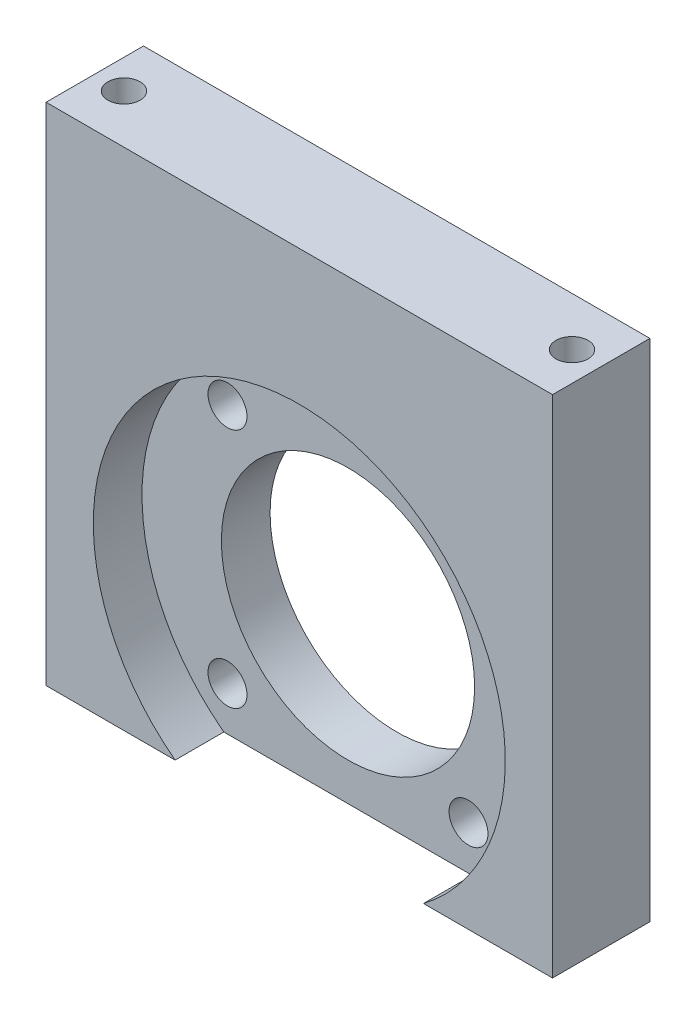
ISO-10303-21;
HEADER;
FILE_DESCRIPTION(('STEP AP214'),'2;1');
FILE_NAME('part.step','',(''),(''),'','','');
FILE_SCHEMA(('AUTOMOTIVE_DESIGN { 1 0 10303 214 1 1 1 1 }'));
ENDSEC;
DATA;
#1=APPLICATION_CONTEXT('core data for automotive mechanical design processes');
#2=APPLICATION_PROTOCOL_DEFINITION('international standard','automotive_design',2000,#1);
#3=PRODUCT_CONTEXT('',#1,'mechanical');
#4=PRODUCT('Part','Part','',(#3));
#5=PRODUCT_RELATED_PRODUCT_CATEGORY('part','',(#4));
#6=PRODUCT_DEFINITION_FORMATION('','',#4);
#7=PRODUCT_DEFINITION_CONTEXT('part definition',#1,'design');
#8=PRODUCT_DEFINITION('design','',#6,#7);
#9=PRODUCT_DEFINITION_SHAPE('','',#8);
#10=(LENGTH_UNIT() NAMED_UNIT(*) SI_UNIT(.MILLI.,.METRE.));
#11=(NAMED_UNIT(*) PLANE_ANGLE_UNIT() SI_UNIT($,.RADIAN.));
#12=(NAMED_UNIT(*) SI_UNIT($,.STERADIAN.) SOLID_ANGLE_UNIT());
#13=UNCERTAINTY_MEASURE_WITH_UNIT(LENGTH_MEASURE(1.E-05),#10,'distance_accuracy_value','');
#14=(GEOMETRIC_REPRESENTATION_CONTEXT(3) GLOBAL_UNCERTAINTY_ASSIGNED_CONTEXT((#13)) GLOBAL_UNIT_ASSIGNED_CONTEXT((#10,
#11,#12)) REPRESENTATION_CONTEXT('',''));
#15=CARTESIAN_POINT('',(0.,0.,0.));
#16=DIRECTION('',(0.,0.,1.));
#17=DIRECTION('',(1.,0.,0.));
#18=AXIS2_PLACEMENT_3D('',#15,#16,#17);
#19=CARTESIAN_POINT('',(26.,25.,-28.));
#20=DIRECTION('',(0.,0.,1.));
#21=DIRECTION('',(1.,0.,0.));
#22=AXIS2_PLACEMENT_3D('',#19,#20,#21);
#23=CYLINDRICAL_SURFACE('',#22,13.);
#24=CARTESIAN_POINT('',(26.,25.,-20.));
#25=DIRECTION('',(0.,0.,1.));
#26=DIRECTION('',(1.,0.,0.));
#27=AXIS2_PLACEMENT_3D('',#24,#25,#26);
#28=CIRCLE('',#27,13.);
#29=CARTESIAN_POINT('',(39.,25.,-20.));
#30=VERTEX_POINT('',#29);
#31=EDGE_CURVE('E218',#30,#30,#28,.T.);
#32=ORIENTED_EDGE('',*,*,#31,.F.);
#33=EDGE_LOOP('',(#32));
#34=FACE_BOUND('',#33,.T.);
#35=CARTESIAN_POINT('',(26.,25.,-15.));
#36=DIRECTION('',(0.,0.,1.));
#37=DIRECTION('',(1.,0.,0.));
#38=AXIS2_PLACEMENT_3D('',#35,#36,#37);
#39=CIRCLE('',#38,13.);
#40=CARTESIAN_POINT('',(39.,25.,-15.));
#41=VERTEX_POINT('',#40);
#42=EDGE_CURVE('E174',#41,#41,#39,.F.);
#43=ORIENTED_EDGE('',*,*,#42,.F.);
#44=EDGE_LOOP('',(#43));
#45=FACE_BOUND('',#44,.T.);
#46=ADVANCED_FACE('F45',(#34,#45),#23,.F.);
#47=CARTESIAN_POINT('',(0.,50.,-20.));
#48=DIRECTION('',(1.,0.,0.));
#49=DIRECTION('',(0.,0.,-1.));
#50=AXIS2_PLACEMENT_3D('',#47,#48,#49);
#51=PLANE('',#50);
#52=DIRECTION('',(0.,0.,-1.));
#53=VECTOR('',#52,1.);
#54=CARTESIAN_POINT('',(0.,8.12563132923549,15.));
#55=LINE('',#54,#53);
#56=CARTESIAN_POINT('',(0.,8.12563132923549,-10.));
#57=VERTEX_POINT('',#56);
#58=CARTESIAN_POINT('',(0.,8.12563132923549,-20.));
#59=VERTEX_POINT('',#58);
#60=EDGE_CURVE('E207',#57,#59,#55,.T.);
#61=ORIENTED_EDGE('',*,*,#60,.F.);
#62=DIRECTION('',(0.,1.,0.));
#63=VECTOR('',#62,1.);
#64=CARTESIAN_POINT('',(0.,-47.,-9.99999999999999));
#65=LINE('',#64,#63);
#66=CARTESIAN_POINT('',(0.,60.,-10.));
#67=VERTEX_POINT('',#66);
#68=EDGE_CURVE('E71',#57,#67,#65,.T.);
#69=ORIENTED_EDGE('',*,*,#68,.T.);
#70=DIRECTION('',(0.,0.,1.));
#71=VECTOR('',#70,1.);
#72=CARTESIAN_POINT('',(0.,60.,-10.));
#73=LINE('',#72,#71);
#74=CARTESIAN_POINT('',(0.,60.,-20.));
#75=VERTEX_POINT('',#74);
#76=EDGE_CURVE('E146',#75,#67,#73,.T.);
#77=ORIENTED_EDGE('',*,*,#76,.F.);
#78=DIRECTION('',(0.,-1.,0.));
#79=VECTOR('',#78,1.);
#80=CARTESIAN_POINT('',(0.,50.,-20.));
#81=LINE('',#80,#79);
#82=EDGE_CURVE('E219',#75,#59,#81,.T.);
#83=ORIENTED_EDGE('',*,*,#82,.T.);
#84=EDGE_LOOP('',(#61,#69,#77,#83));
#85=FACE_BOUND('',#84,.T.);
#86=ADVANCED_FACE('F47',(#85),#51,.F.);
#87=CARTESIAN_POINT('',(52.,50.,0.));
#88=DIRECTION('',(-1.,0.,0.));
#89=DIRECTION('',(0.,0.,1.));
#90=AXIS2_PLACEMENT_3D('',#87,#88,#89);
#91=PLANE('',#90);
#92=DIRECTION('',(0.,-1.,0.));
#93=VECTOR('',#92,1.);
#94=CARTESIAN_POINT('',(52.,50.,-20.));
#95=LINE('',#94,#93);
#96=CARTESIAN_POINT('',(52.,60.,-20.));
#97=VERTEX_POINT('',#96);
#98=CARTESIAN_POINT('',(52.,8.12563132923548,-20.));
#99=VERTEX_POINT('',#98);
#100=EDGE_CURVE('E223',#97,#99,#95,.T.);
#101=ORIENTED_EDGE('',*,*,#100,.F.);
#102=DIRECTION('',(0.,0.,-1.));
#103=VECTOR('',#102,1.);
#104=CARTESIAN_POINT('',(52.,60.,-10.));
#105=LINE('',#104,#103);
#106=CARTESIAN_POINT('',(52.,60.,-10.));
#107=VERTEX_POINT('',#106);
#108=EDGE_CURVE('E138',#107,#97,#105,.T.);
#109=ORIENTED_EDGE('',*,*,#108,.F.);
#110=DIRECTION('',(0.,1.,0.));
#111=VECTOR('',#110,1.);
#112=CARTESIAN_POINT('',(52.,-47.,-10.));
#113=LINE('',#112,#111);
#114=CARTESIAN_POINT('',(52.,8.12563132923547,-10.));
#115=VERTEX_POINT('',#114);
#116=EDGE_CURVE('E178',#115,#107,#113,.T.);
#117=ORIENTED_EDGE('',*,*,#116,.F.);
#118=DIRECTION('',(0.,0.,-1.));
#119=VECTOR('',#118,1.);
#120=CARTESIAN_POINT('',(52.,8.12563132923548,15.));
#121=LINE('',#120,#119);
#122=EDGE_CURVE('E206',#115,#99,#121,.T.);
#123=ORIENTED_EDGE('',*,*,#122,.T.);
#124=EDGE_LOOP('',(#101,#109,#117,#123));
#125=FACE_BOUND('',#124,.T.);
#126=ADVANCED_FACE('F272',(#125),#91,.F.);
#127=CARTESIAN_POINT('',(52.,50.,-20.));
#128=DIRECTION('',(0.,0.,1.));
#129=DIRECTION('',(1.,0.,0.));
#130=AXIS2_PLACEMENT_3D('',#127,#128,#129);
#131=PLANE('',#130);
#132=CARTESIAN_POINT('',(38.3743686707646,12.6256313292355,-20.));
#133=DIRECTION('',(0.,0.,-1.));
#134=DIRECTION('',(1.,0.,0.));
#135=AXIS2_PLACEMENT_3D('',#132,#133,#134);
#136=CIRCLE('',#135,2.);
#137=CARTESIAN_POINT('',(40.3743686707646,12.6256313292355,-20.));
#138=VERTEX_POINT('',#137);
#139=EDGE_CURVE('E154',#138,#138,#136,.T.);
#140=ORIENTED_EDGE('',*,*,#139,.F.);
#141=EDGE_LOOP('',(#140));
#142=FACE_BOUND('',#141,.T.);
#143=CARTESIAN_POINT('',(13.6256313292354,12.6256313292355,-20.));
#144=DIRECTION('',(0.,0.,-1.));
#145=DIRECTION('',(-1.,0.,0.));
#146=AXIS2_PLACEMENT_3D('',#143,#144,#145);
#147=CIRCLE('',#146,2.);
#148=CARTESIAN_POINT('',(11.6256313292354,12.6256313292355,-20.));
#149=VERTEX_POINT('',#148);
#150=EDGE_CURVE('E160',#149,#149,#147,.T.);
#151=ORIENTED_EDGE('',*,*,#150,.F.);
#152=EDGE_LOOP('',(#151));
#153=FACE_BOUND('',#152,.T.);
#154=CARTESIAN_POINT('',(13.6256313292354,37.3743686707645,-20.));
#155=DIRECTION('',(0.,0.,-1.));
#156=DIRECTION('',(1.,0.,0.));
#157=AXIS2_PLACEMENT_3D('',#154,#155,#156);
#158=CIRCLE('',#157,2.);
#159=CARTESIAN_POINT('',(15.6256313292354,37.3743686707645,-20.));
#160=VERTEX_POINT('',#159);
#161=EDGE_CURVE('E155',#160,#160,#158,.T.);
#162=ORIENTED_EDGE('',*,*,#161,.F.);
#163=EDGE_LOOP('',(#162));
#164=FACE_BOUND('',#163,.T.);
#165=CARTESIAN_POINT('',(38.3743686707647,37.3743686707645,-20.));
#166=DIRECTION('',(0.,0.,-1.));
#167=DIRECTION('',(-1.,0.,0.));
#168=AXIS2_PLACEMENT_3D('',#165,#166,#167);
#169=CIRCLE('',#168,2.);
#170=CARTESIAN_POINT('',(36.3743686707646,37.3743686707645,-20.));
#171=VERTEX_POINT('',#170);
#172=EDGE_CURVE('E159',#171,#171,#169,.T.);
#173=ORIENTED_EDGE('',*,*,#172,.F.);
#174=EDGE_LOOP('',(#173));
#175=FACE_BOUND('',#174,.T.);
#176=ORIENTED_EDGE('',*,*,#31,.T.);
#177=EDGE_LOOP('',(#176));
#178=FACE_BOUND('',#177,.T.);
#179=ORIENTED_EDGE('',*,*,#100,.T.);
#180=DIRECTION('',(1.,0.,0.));
#181=VECTOR('',#180,1.);
#182=CARTESIAN_POINT('',(38.3743686707646,8.12563132923548,-20.));
#183=LINE('',#182,#181);
#184=EDGE_CURVE('E202',#59,#99,#183,.T.);
#185=ORIENTED_EDGE('',*,*,#184,.F.);
#186=ORIENTED_EDGE('',*,*,#82,.F.);
#187=DIRECTION('',(-1.,0.,0.));
#188=VECTOR('',#187,1.);
#189=CARTESIAN_POINT('',(52.,60.,-20.));
#190=LINE('',#189,#188);
#191=EDGE_CURVE('E142',#97,#75,#190,.T.);
#192=ORIENTED_EDGE('',*,*,#191,.F.);
#193=EDGE_LOOP('',(#179,#185,#186,#192));
#194=FACE_BOUND('',#193,.T.);
#195=ADVANCED_FACE('F282',(#142,#153,#164,#175,#178,#194),#131,.F.);
#196=CARTESIAN_POINT('',(26.,25.,-13.));
#197=DIRECTION('',(0.,0.,1.));
#198=DIRECTION('',(1.,0.,0.));
#199=AXIS2_PLACEMENT_3D('',#196,#197,#198);
#200=CYLINDRICAL_SURFACE('',#199,21.15);
#201=DIRECTION('',(0.,0.,1.));
#202=VECTOR('',#201,1.);
#203=CARTESIAN_POINT('',(38.7506149641153,8.12563132923548,-13.));
#204=LINE('',#203,#202);
#205=CARTESIAN_POINT('',(38.7506149641153,8.12563132923548,-15.));
#206=VERTEX_POINT('',#205);
#207=CARTESIAN_POINT('',(38.7506149641153,8.12563132923548,-10.));
#208=VERTEX_POINT('',#207);
#209=EDGE_CURVE('E210',#206,#208,#204,.T.);
#210=ORIENTED_EDGE('',*,*,#209,.T.);
#211=CARTESIAN_POINT('',(26.,25.,-10.));
#212=DIRECTION('',(0.,0.,-1.));
#213=DIRECTION('',(-1.,0.,0.));
#214=AXIS2_PLACEMENT_3D('',#211,#212,#213);
#215=CIRCLE('',#214,21.15);
#216=CARTESIAN_POINT('',(13.2493850358847,8.12563132923549,-10.));
#217=VERTEX_POINT('',#216);
#218=EDGE_CURVE('E181',#208,#217,#215,.F.);
#219=ORIENTED_EDGE('',*,*,#218,.T.);
#220=DIRECTION('',(0.,0.,1.));
#221=VECTOR('',#220,1.);
#222=CARTESIAN_POINT('',(13.2493850358847,8.12563132923549,-13.));
#223=LINE('',#222,#221);
#224=CARTESIAN_POINT('',(13.2493850358847,8.12563132923549,-15.));
#225=VERTEX_POINT('',#224);
#226=EDGE_CURVE('E63',#217,#225,#223,.F.);
#227=ORIENTED_EDGE('',*,*,#226,.T.);
#228=CARTESIAN_POINT('',(26.,25.,-15.));
#229=DIRECTION('',(0.,0.,1.));
#230=DIRECTION('',(1.,0.,0.));
#231=AXIS2_PLACEMENT_3D('',#228,#229,#230);
#232=CIRCLE('',#231,21.15);
#233=EDGE_CURVE('E171',#206,#225,#232,.T.);
#234=ORIENTED_EDGE('',*,*,#233,.F.);
#235=EDGE_LOOP('',(#210,#219,#227,#234));
#236=FACE_BOUND('',#235,.T.);
#237=ADVANCED_FACE('F279',(#236),#200,.F.);
#238=CARTESIAN_POINT('',(38.3743686707647,8.12563132923548,15.));
#239=DIRECTION('',(0.,1.,0.));
#240=DIRECTION('',(-1.,0.,0.));
#241=AXIS2_PLACEMENT_3D('',#238,#239,#240);
#242=PLANE('',#241);
#243=CARTESIAN_POINT('',(3.,8.12563132923549,-15.));
#244=DIRECTION('',(0.,-1.,0.));
#245=DIRECTION('',(0.,0.,-1.));
#246=AXIS2_PLACEMENT_3D('',#243,#244,#245);
#247=CIRCLE('',#246,1.64999999999999);
#248=CARTESIAN_POINT('',(3.,8.12563132923549,-16.65));
#249=VERTEX_POINT('',#248);
#250=EDGE_CURVE('E186',#249,#249,#247,.T.);
#251=ORIENTED_EDGE('',*,*,#250,.F.);
#252=EDGE_LOOP('',(#251));
#253=FACE_BOUND('',#252,.T.);
#254=CARTESIAN_POINT('',(49.,8.12563132923549,-15.));
#255=DIRECTION('',(0.,-1.,0.));
#256=DIRECTION('',(0.,0.,-1.));
#257=AXIS2_PLACEMENT_3D('',#254,#255,#256);
#258=CIRCLE('',#257,1.64999999999999);
#259=CARTESIAN_POINT('',(49.,8.12563132923549,-16.65));
#260=VERTEX_POINT('',#259);
#261=EDGE_CURVE('E194',#260,#260,#258,.T.);
#262=ORIENTED_EDGE('',*,*,#261,.F.);
#263=EDGE_LOOP('',(#262));
#264=FACE_BOUND('',#263,.T.);
#265=DIRECTION('',(1.,0.,0.));
#266=VECTOR('',#265,1.);
#267=CARTESIAN_POINT('',(38.3743686707647,8.12563132923548,-15.));
#268=LINE('',#267,#266);
#269=EDGE_CURVE('E11',#225,#206,#268,.T.);
#270=ORIENTED_EDGE('',*,*,#269,.F.);
#271=ORIENTED_EDGE('',*,*,#226,.F.);
#272=DIRECTION('',(-1.,0.,0.));
#273=VECTOR('',#272,1.);
#274=CARTESIAN_POINT('',(38.3743686707647,8.12563132923548,-10.));
#275=LINE('',#274,#273);
#276=EDGE_CURVE('E227',#217,#57,#275,.T.);
#277=ORIENTED_EDGE('',*,*,#276,.T.);
#278=ORIENTED_EDGE('',*,*,#60,.T.);
#279=ORIENTED_EDGE('',*,*,#184,.T.);
#280=ORIENTED_EDGE('',*,*,#122,.F.);
#281=EDGE_CURVE('E55',#115,#208,#275,.T.);
#282=ORIENTED_EDGE('',*,*,#281,.T.);
#283=ORIENTED_EDGE('',*,*,#209,.F.);
#284=EDGE_LOOP('',(#270,#271,#277,#278,#279,#280,#282,#283));
#285=FACE_BOUND('',#284,.T.);
#286=ADVANCED_FACE('F277',(#253,#264,#285),#242,.F.);
#287=CARTESIAN_POINT('',(49.,23.1256313292355,-15.));
#288=DIRECTION('',(0.,-1.,0.));
#289=DIRECTION('',(0.,0.,-1.));
#290=AXIS2_PLACEMENT_3D('',#287,#288,#289);
#291=CONICAL_SURFACE('',#290,1.64999999999998,1.02974425867665);
#292=CARTESIAN_POINT('',(49.,24.117051350631,-15.));
#293=VERTEX_POINT('',#292);
#294=VERTEX_LOOP('',#293);
#295=FACE_BOUND('',#294,.T.);
#296=CARTESIAN_POINT('',(49.,23.1256313292355,-15.));
#297=DIRECTION('',(0.,-1.,0.));
#298=DIRECTION('',(0.,0.,-1.));
#299=AXIS2_PLACEMENT_3D('',#296,#297,#298);
#300=CIRCLE('',#299,1.64999999999998);
#301=CARTESIAN_POINT('',(49.,23.1256313292355,-16.65));
#302=VERTEX_POINT('',#301);
#303=EDGE_CURVE('E198',#302,#302,#300,.T.);
#304=ORIENTED_EDGE('',*,*,#303,.T.);
#305=EDGE_LOOP('',(#304));
#306=FACE_BOUND('',#305,.T.);
#307=ADVANCED_FACE('F303',(#295,#306),#291,.F.);
#308=CARTESIAN_POINT('',(49.,8.12563132923549,-15.));
#309=DIRECTION('',(0.,-1.,0.));
#310=DIRECTION('',(0.,0.,-1.));
#311=AXIS2_PLACEMENT_3D('',#308,#309,#310);
#312=CYLINDRICAL_SURFACE('',#311,1.64999999999999);
#313=ORIENTED_EDGE('',*,*,#303,.F.);
#314=EDGE_LOOP('',(#313));
#315=FACE_BOUND('',#314,.T.);
#316=ORIENTED_EDGE('',*,*,#261,.T.);
#317=EDGE_LOOP('',(#316));
#318=FACE_BOUND('',#317,.T.);
#319=ADVANCED_FACE('F308',(#315,#318),#312,.F.);
#320=CARTESIAN_POINT('',(3.,23.1256313292355,-15.));
#321=DIRECTION('',(0.,-1.,0.));
#322=DIRECTION('',(0.,0.,-1.));
#323=AXIS2_PLACEMENT_3D('',#320,#321,#322);
#324=CONICAL_SURFACE('',#323,1.64999999999999,1.02974425867665);
#325=CARTESIAN_POINT('',(3.,24.117051350631,-15.));
#326=VERTEX_POINT('',#325);
#327=VERTEX_LOOP('',#326);
#328=FACE_BOUND('',#327,.T.);
#329=CARTESIAN_POINT('',(3.,23.1256313292355,-15.));
#330=DIRECTION('',(0.,-1.,0.));
#331=DIRECTION('',(0.,0.,-1.));
#332=AXIS2_PLACEMENT_3D('',#329,#330,#331);
#333=CIRCLE('',#332,1.64999999999999);
#334=CARTESIAN_POINT('',(3.,23.1256313292355,-16.65));
#335=VERTEX_POINT('',#334);
#336=EDGE_CURVE('E190',#335,#335,#333,.T.);
#337=ORIENTED_EDGE('',*,*,#336,.T.);
#338=EDGE_LOOP('',(#337));
#339=FACE_BOUND('',#338,.T.);
#340=ADVANCED_FACE('F315',(#328,#339),#324,.F.);
#341=CARTESIAN_POINT('',(3.,8.12563132923549,-15.));
#342=DIRECTION('',(0.,-1.,0.));
#343=DIRECTION('',(0.,0.,-1.));
#344=AXIS2_PLACEMENT_3D('',#341,#342,#343);
#345=CYLINDRICAL_SURFACE('',#344,1.64999999999999);
#346=ORIENTED_EDGE('',*,*,#336,.F.);
#347=EDGE_LOOP('',(#346));
#348=FACE_BOUND('',#347,.T.);
#349=ORIENTED_EDGE('',*,*,#250,.T.);
#350=EDGE_LOOP('',(#349));
#351=FACE_BOUND('',#350,.T.);
#352=ADVANCED_FACE('F321',(#348,#351),#345,.F.);
#353=CARTESIAN_POINT('',(0.,-47.,-9.99999999999999));
#354=DIRECTION('',(0.,0.,-1.));
#355=DIRECTION('',(-1.,0.,0.));
#356=AXIS2_PLACEMENT_3D('',#353,#354,#355);
#357=PLANE('',#356);
#358=ORIENTED_EDGE('',*,*,#116,.T.);
#359=DIRECTION('',(1.,0.,0.));
#360=VECTOR('',#359,1.);
#361=CARTESIAN_POINT('',(52.,60.,-10.));
#362=LINE('',#361,#360);
#363=EDGE_CURVE('E150',#67,#107,#362,.T.);
#364=ORIENTED_EDGE('',*,*,#363,.F.);
#365=ORIENTED_EDGE('',*,*,#68,.F.);
#366=ORIENTED_EDGE('',*,*,#276,.F.);
#367=ORIENTED_EDGE('',*,*,#218,.F.);
#368=ORIENTED_EDGE('',*,*,#281,.F.);
#369=EDGE_LOOP('',(#358,#364,#365,#366,#367,#368));
#370=FACE_BOUND('',#369,.T.);
#371=ADVANCED_FACE('F255',(#370),#357,.F.);
#372=CARTESIAN_POINT('',(26.,25.,-15.));
#373=DIRECTION('',(0.,0.,1.));
#374=DIRECTION('',(1.,0.,0.));
#375=AXIS2_PLACEMENT_3D('',#372,#373,#374);
#376=PLANE('',#375);
#377=CARTESIAN_POINT('',(38.3743686707646,12.6256313292355,-15.));
#378=DIRECTION('',(0.,0.,1.));
#379=DIRECTION('',(1.,0.,0.));
#380=AXIS2_PLACEMENT_3D('',#377,#378,#379);
#381=CIRCLE('',#380,2.);
#382=CARTESIAN_POINT('',(40.3743686707646,12.6256313292355,-15.));
#383=VERTEX_POINT('',#382);
#384=EDGE_CURVE('E49',#383,#383,#381,.T.);
#385=ORIENTED_EDGE('',*,*,#384,.F.);
#386=EDGE_LOOP('',(#385));
#387=FACE_BOUND('',#386,.T.);
#388=CARTESIAN_POINT('',(13.6256313292354,12.6256313292355,-15.));
#389=DIRECTION('',(0.,0.,1.));
#390=DIRECTION('',(1.,0.,0.));
#391=AXIS2_PLACEMENT_3D('',#388,#389,#390);
#392=CIRCLE('',#391,2.);
#393=CARTESIAN_POINT('',(15.6256313292354,12.6256313292355,-15.));
#394=VERTEX_POINT('',#393);
#395=EDGE_CURVE('E239',#394,#394,#392,.T.);
#396=ORIENTED_EDGE('',*,*,#395,.F.);
#397=EDGE_LOOP('',(#396));
#398=FACE_BOUND('',#397,.T.);
#399=CARTESIAN_POINT('',(13.6256313292354,37.3743686707645,-15.));
#400=DIRECTION('',(0.,0.,1.));
#401=DIRECTION('',(1.,0.,0.));
#402=AXIS2_PLACEMENT_3D('',#399,#400,#401);
#403=CIRCLE('',#402,2.);
#404=CARTESIAN_POINT('',(15.6256313292354,37.3743686707645,-15.));
#405=VERTEX_POINT('',#404);
#406=EDGE_CURVE('E236',#405,#405,#403,.T.);
#407=ORIENTED_EDGE('',*,*,#406,.F.);
#408=EDGE_LOOP('',(#407));
#409=FACE_BOUND('',#408,.T.);
#410=CARTESIAN_POINT('',(38.3743686707647,37.3743686707645,-15.));
#411=DIRECTION('',(0.,0.,1.));
#412=DIRECTION('',(1.,0.,0.));
#413=AXIS2_PLACEMENT_3D('',#410,#411,#412);
#414=CIRCLE('',#413,2.);
#415=CARTESIAN_POINT('',(40.3743686707647,37.3743686707645,-15.));
#416=VERTEX_POINT('',#415);
#417=EDGE_CURVE('E170',#416,#416,#414,.T.);
#418=ORIENTED_EDGE('',*,*,#417,.F.);
#419=EDGE_LOOP('',(#418));
#420=FACE_BOUND('',#419,.T.);
#421=ORIENTED_EDGE('',*,*,#269,.T.);
#422=ORIENTED_EDGE('',*,*,#233,.T.);
#423=EDGE_LOOP('',(#421,#422));
#424=FACE_BOUND('',#423,.T.);
#425=ORIENTED_EDGE('',*,*,#42,.T.);
#426=EDGE_LOOP('',(#425));
#427=FACE_BOUND('',#426,.T.);
#428=ADVANCED_FACE('F251',(#387,#398,#409,#420,#424,#427),#376,.T.);
#429=CARTESIAN_POINT('',(38.3743686707647,37.3743686707645,-10.));
#430=DIRECTION('',(0.,0.,-1.));
#431=DIRECTION('',(-1.,0.,0.));
#432=AXIS2_PLACEMENT_3D('',#429,#430,#431);
#433=CYLINDRICAL_SURFACE('',#432,2.);
#434=ORIENTED_EDGE('',*,*,#417,.T.);
#435=EDGE_LOOP('',(#434));
#436=FACE_BOUND('',#435,.T.);
#437=ORIENTED_EDGE('',*,*,#172,.T.);
#438=EDGE_LOOP('',(#437));
#439=FACE_BOUND('',#438,.T.);
#440=ADVANCED_FACE('F254',(#436,#439),#433,.F.);
#441=CARTESIAN_POINT('',(13.6256313292354,37.3743686707645,-9.99999999999999));
#442=DIRECTION('',(0.,0.,-1.));
#443=DIRECTION('',(-1.,0.,0.));
#444=AXIS2_PLACEMENT_3D('',#441,#442,#443);
#445=CYLINDRICAL_SURFACE('',#444,2.);
#446=ORIENTED_EDGE('',*,*,#406,.T.);
#447=EDGE_LOOP('',(#446));
#448=FACE_BOUND('',#447,.T.);
#449=ORIENTED_EDGE('',*,*,#161,.T.);
#450=EDGE_LOOP('',(#449));
#451=FACE_BOUND('',#450,.T.);
#452=ADVANCED_FACE('F333',(#448,#451),#445,.F.);
#453=CARTESIAN_POINT('',(13.6256313292354,12.6256313292355,-9.99999999999999));
#454=DIRECTION('',(0.,0.,-1.));
#455=DIRECTION('',(-1.,0.,0.));
#456=AXIS2_PLACEMENT_3D('',#453,#454,#455);
#457=CYLINDRICAL_SURFACE('',#456,2.);
#458=ORIENTED_EDGE('',*,*,#395,.T.);
#459=EDGE_LOOP('',(#458));
#460=FACE_BOUND('',#459,.T.);
#461=ORIENTED_EDGE('',*,*,#150,.T.);
#462=EDGE_LOOP('',(#461));
#463=FACE_BOUND('',#462,.T.);
#464=ADVANCED_FACE('F337',(#460,#463),#457,.F.);
#465=CARTESIAN_POINT('',(38.3743686707646,12.6256313292355,-10.));
#466=DIRECTION('',(0.,0.,-1.));
#467=DIRECTION('',(-1.,0.,0.));
#468=AXIS2_PLACEMENT_3D('',#465,#466,#467);
#469=CYLINDRICAL_SURFACE('',#468,2.);
#470=ORIENTED_EDGE('',*,*,#384,.T.);
#471=EDGE_LOOP('',(#470));
#472=FACE_BOUND('',#471,.T.);
#473=ORIENTED_EDGE('',*,*,#139,.T.);
#474=EDGE_LOOP('',(#473));
#475=FACE_BOUND('',#474,.T.);
#476=ADVANCED_FACE('F248',(#472,#475),#469,.F.);
#477=CARTESIAN_POINT('',(0.,60.,0.));
#478=DIRECTION('',(0.,1.,0.));
#479=DIRECTION('',(0.,0.,1.));
#480=AXIS2_PLACEMENT_3D('',#477,#478,#479);
#481=PLANE('',#480);
#482=CARTESIAN_POINT('',(3.,60.,-15.));
#483=DIRECTION('',(0.,1.,0.));
#484=DIRECTION('',(0.,0.,1.));
#485=AXIS2_PLACEMENT_3D('',#482,#483,#484);
#486=CIRCLE('',#485,1.64999999999999);
#487=CARTESIAN_POINT('',(3.,60.,-13.35));
#488=VERTEX_POINT('',#487);
#489=EDGE_CURVE('E125',#488,#488,#486,.T.);
#490=ORIENTED_EDGE('',*,*,#489,.F.);
#491=EDGE_LOOP('',(#490));
#492=FACE_BOUND('',#491,.T.);
#493=CARTESIAN_POINT('',(49.,60.,-15.));
#494=DIRECTION('',(0.,1.,0.));
#495=DIRECTION('',(0.,0.,1.));
#496=AXIS2_PLACEMENT_3D('',#493,#494,#495);
#497=CIRCLE('',#496,1.64999999999999);
#498=CARTESIAN_POINT('',(49.,60.,-13.35));
#499=VERTEX_POINT('',#498);
#500=EDGE_CURVE('E124',#499,#499,#497,.T.);
#501=ORIENTED_EDGE('',*,*,#500,.F.);
#502=EDGE_LOOP('',(#501));
#503=FACE_BOUND('',#502,.T.);
#504=ORIENTED_EDGE('',*,*,#108,.T.);
#505=ORIENTED_EDGE('',*,*,#191,.T.);
#506=ORIENTED_EDGE('',*,*,#76,.T.);
#507=ORIENTED_EDGE('',*,*,#363,.T.);
#508=EDGE_LOOP('',(#504,#505,#506,#507));
#509=FACE_BOUND('',#508,.T.);
#510=ADVANCED_FACE('F297',(#492,#503,#509),#481,.T.);
#511=CARTESIAN_POINT('',(49.,45.,-15.));
#512=DIRECTION('',(0.,1.,0.));
#513=DIRECTION('',(0.,0.,1.));
#514=AXIS2_PLACEMENT_3D('',#511,#512,#513);
#515=CONICAL_SURFACE('',#514,1.64999999999998,1.02974425867665);
#516=CARTESIAN_POINT('',(49.,44.0085799786045,-15.));
#517=VERTEX_POINT('',#516);
#518=VERTEX_LOOP('',#517);
#519=FACE_BOUND('',#518,.T.);
#520=CARTESIAN_POINT('',(49.,45.,-15.));
#521=DIRECTION('',(0.,1.,0.));
#522=DIRECTION('',(0.,0.,1.));
#523=AXIS2_PLACEMENT_3D('',#520,#521,#522);
#524=CIRCLE('',#523,1.64999999999998);
#525=CARTESIAN_POINT('',(49.,45.,-13.35));
#526=VERTEX_POINT('',#525);
#527=EDGE_CURVE('E130',#526,#526,#524,.T.);
#528=ORIENTED_EDGE('',*,*,#527,.T.);
#529=EDGE_LOOP('',(#528));
#530=FACE_BOUND('',#529,.T.);
#531=ADVANCED_FACE('F345',(#519,#530),#515,.F.);
#532=CARTESIAN_POINT('',(49.,60.,-15.));
#533=DIRECTION('',(0.,1.,0.));
#534=DIRECTION('',(0.,0.,1.));
#535=AXIS2_PLACEMENT_3D('',#532,#533,#534);
#536=CYLINDRICAL_SURFACE('',#535,1.64999999999999);
#537=ORIENTED_EDGE('',*,*,#527,.F.);
#538=EDGE_LOOP('',(#537));
#539=FACE_BOUND('',#538,.T.);
#540=ORIENTED_EDGE('',*,*,#500,.T.);
#541=EDGE_LOOP('',(#540));
#542=FACE_BOUND('',#541,.T.);
#543=ADVANCED_FACE('F117',(#539,#542),#536,.F.);
#544=CARTESIAN_POINT('',(3.,45.,-15.));
#545=DIRECTION('',(0.,1.,0.));
#546=DIRECTION('',(0.,0.,1.));
#547=AXIS2_PLACEMENT_3D('',#544,#545,#546);
#548=CONICAL_SURFACE('',#547,1.64999999999999,1.02974425867665);
#549=CARTESIAN_POINT('',(3.,44.0085799786045,-15.));
#550=VERTEX_POINT('',#549);
#551=VERTEX_LOOP('',#550);
#552=FACE_BOUND('',#551,.T.);
#553=CARTESIAN_POINT('',(3.,45.,-15.));
#554=DIRECTION('',(0.,1.,0.));
#555=DIRECTION('',(0.,0.,1.));
#556=AXIS2_PLACEMENT_3D('',#553,#554,#555);
#557=CIRCLE('',#556,1.64999999999999);
#558=CARTESIAN_POINT('',(3.,45.,-13.35));
#559=VERTEX_POINT('',#558);
#560=EDGE_CURVE('E121',#559,#559,#557,.T.);
#561=ORIENTED_EDGE('',*,*,#560,.T.);
#562=EDGE_LOOP('',(#561));
#563=FACE_BOUND('',#562,.T.);
#564=ADVANCED_FACE('F113',(#552,#563),#548,.F.);
#565=CARTESIAN_POINT('',(3.,60.,-15.));
#566=DIRECTION('',(0.,1.,0.));
#567=DIRECTION('',(0.,0.,1.));
#568=AXIS2_PLACEMENT_3D('',#565,#566,#567);
#569=CYLINDRICAL_SURFACE('',#568,1.64999999999999);
#570=ORIENTED_EDGE('',*,*,#560,.F.);
#571=EDGE_LOOP('',(#570));
#572=FACE_BOUND('',#571,.T.);
#573=ORIENTED_EDGE('',*,*,#489,.T.);
#574=EDGE_LOOP('',(#573));
#575=FACE_BOUND('',#574,.T.);
#576=ADVANCED_FACE('F116',(#572,#575),#569,.F.);
#577=CLOSED_SHELL('',(#46,#86,#126,#195,#237,#286,#307,#319,#340,#352,#371,#428,#440,#452,#464,
#476,#510,#531,#543,#564,#576));
#578=MANIFOLD_SOLID_BREP('B2',#577);
#579=ADVANCED_BREP_SHAPE_REPRESENTATION('',(#18,#578),#14);
#580=SHAPE_DEFINITION_REPRESENTATION(#9,#579);
ENDSEC;
END-ISO-10303-21;
